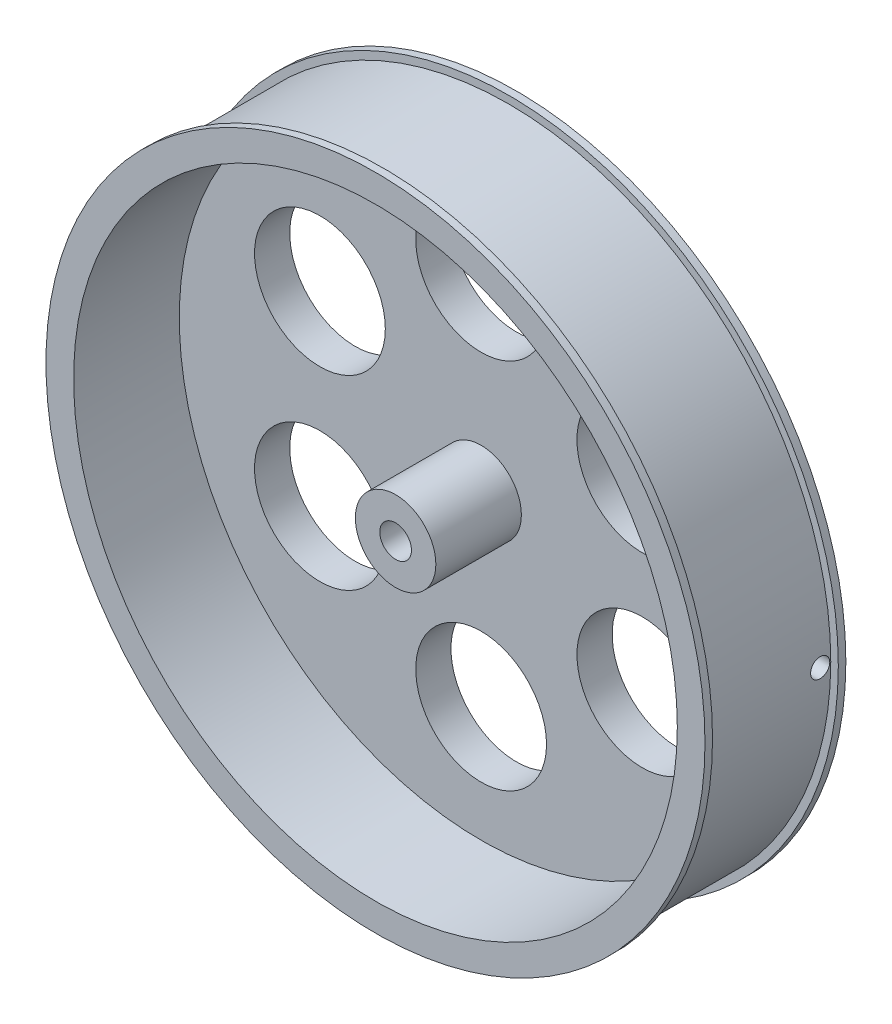
ISO-10303-21;
HEADER;
FILE_DESCRIPTION(('STEP AP214'),'2;1');
FILE_NAME('part.step','',(''),(''),'','','');
FILE_SCHEMA(('AUTOMOTIVE_DESIGN { 1 0 10303 214 1 1 1 1 }'));
ENDSEC;
DATA;
#1=APPLICATION_CONTEXT('core data for automotive mechanical design processes');
#2=APPLICATION_PROTOCOL_DEFINITION('international standard','automotive_design',2000,#1);
#3=PRODUCT_CONTEXT('',#1,'mechanical');
#4=PRODUCT('Part','Part','',(#3));
#5=PRODUCT_RELATED_PRODUCT_CATEGORY('part','',(#4));
#6=PRODUCT_DEFINITION_FORMATION('','',#4);
#7=PRODUCT_DEFINITION_CONTEXT('part definition',#1,'design');
#8=PRODUCT_DEFINITION('design','',#6,#7);
#9=PRODUCT_DEFINITION_SHAPE('','',#8);
#10=(LENGTH_UNIT() NAMED_UNIT(*) SI_UNIT(.MILLI.,.METRE.));
#11=(NAMED_UNIT(*) PLANE_ANGLE_UNIT() SI_UNIT($,.RADIAN.));
#12=(NAMED_UNIT(*) SI_UNIT($,.STERADIAN.) SOLID_ANGLE_UNIT());
#13=UNCERTAINTY_MEASURE_WITH_UNIT(LENGTH_MEASURE(1.E-05),#10,'distance_accuracy_value','');
#14=(GEOMETRIC_REPRESENTATION_CONTEXT(3) GLOBAL_UNCERTAINTY_ASSIGNED_CONTEXT((#13)) GLOBAL_UNIT_ASSIGNED_CONTEXT((#10,
#11,#12)) REPRESENTATION_CONTEXT('',''));
#15=CARTESIAN_POINT('',(0.,0.,0.));
#16=DIRECTION('',(0.,0.,1.));
#17=DIRECTION('',(1.,0.,0.));
#18=AXIS2_PLACEMENT_3D('',#15,#16,#17);
#19=CARTESIAN_POINT('',(0.,0.,28.));
#20=DIRECTION('',(0.,0.,-1.));
#21=DIRECTION('',(-1.,0.,0.));
#22=AXIS2_PLACEMENT_3D('',#19,#20,#21);
#23=CYLINDRICAL_SURFACE('',#22,64.);
#24=CARTESIAN_POINT('',(0.,0.,1.5));
#25=DIRECTION('',(0.,0.,1.));
#26=DIRECTION('',(1.,0.,0.));
#27=AXIS2_PLACEMENT_3D('',#24,#25,#26);
#28=CIRCLE('',#27,64.);
#29=CARTESIAN_POINT('',(64.,0.,1.5));
#30=VERTEX_POINT('',#29);
#31=EDGE_CURVE('E130',#30,#30,#28,.T.);
#32=ORIENTED_EDGE('',*,*,#31,.T.);
#33=EDGE_LOOP('',(#32));
#34=FACE_BOUND('',#33,.T.);
#35=CARTESIAN_POINT('',(0.,0.,26.5));
#36=DIRECTION('',(0.,0.,1.));
#37=DIRECTION('',(1.,0.,0.));
#38=AXIS2_PLACEMENT_3D('',#35,#36,#37);
#39=CIRCLE('',#38,64.);
#40=CARTESIAN_POINT('',(64.,0.,26.5));
#41=VERTEX_POINT('',#40);
#42=EDGE_CURVE('E47',#41,#41,#39,.T.);
#43=ORIENTED_EDGE('',*,*,#42,.F.);
#44=EDGE_LOOP('',(#43));
#45=FACE_BOUND('',#44,.T.);
#46=CARTESIAN_POINT('',(64.,0.,5.5));
#47=CARTESIAN_POINT('',(63.9999996199994,-0.106698612345607,5.49999527608061));
#48=CARTESIAN_POINT('',(63.9997303111057,-0.213473992693703,5.49098199431522));
#49=CARTESIAN_POINT('',(63.9986818741941,-0.424082374028197,5.45515226980288));
#50=CARTESIAN_POINT('',(63.9979021371134,-0.527911705051908,5.42831455769016));
#51=CARTESIAN_POINT('',(63.9959211475545,-0.72954643512145,5.35760220562604));
#52=CARTESIAN_POINT('',(63.9947201012045,-0.827354752525751,5.31373589589952));
#53=CARTESIAN_POINT('',(63.992031970981,-1.01419188196472,5.21022348904253));
#54=CARTESIAN_POINT('',(63.9905449569841,-1.10322283074151,5.15058124545399));
#55=CARTESIAN_POINT('',(63.9874515815209,-1.27004538019352,5.01717851573469));
#56=CARTESIAN_POINT('',(63.9858451749512,-1.34783270032114,4.94341267734249));
#57=CARTESIAN_POINT('',(63.9826944645377,-1.48992390514263,4.78386598718598));
#58=CARTESIAN_POINT('',(63.9811501631684,-1.5542272529904,4.69808465726786));
#59=CARTESIAN_POINT('',(63.9782975894916,-1.66753171355214,4.51692630096137));
#60=CARTESIAN_POINT('',(63.9769893564606,-1.71653028087621,4.42154768189913));
#61=CARTESIAN_POINT('',(63.9747568535961,-1.79781771133189,4.22391355579053));
#62=CARTESIAN_POINT('',(63.9738325822384,-1.83010664079925,4.1216580760465));
#63=CARTESIAN_POINT('',(63.9724725474494,-1.87704909606199,3.91320499276548));
#64=CARTESIAN_POINT('',(63.9720366391171,-1.89170785295673,3.80700856820308));
#65=CARTESIAN_POINT('',(63.9717020450109,-1.90298996714018,3.5936614448837));
#66=CARTESIAN_POINT('',(63.9718033571168,-1.89961339560664,3.48651074989449));
#67=CARTESIAN_POINT('',(63.9725316441729,-1.87492512980514,3.27433219245221));
#68=CARTESIAN_POINT('',(63.973158453323,-1.85361909247487,3.16930367113238));
#69=CARTESIAN_POINT('',(63.9748668133079,-1.793685444515,2.96431477686415));
#70=CARTESIAN_POINT('',(63.9759483651329,-1.75505779616508,2.86435441495292));
#71=CARTESIAN_POINT('',(63.9784444790023,-1.6615709348067,2.67232116840527));
#72=CARTESIAN_POINT('',(63.9798590942345,-1.60670912896074,2.58024954675));
#73=CARTESIAN_POINT('',(63.9828618091305,-1.48231321132906,2.40662122494208));
#74=CARTESIAN_POINT('',(63.9844499091809,-1.41277906683822,2.32506454822823));
#75=CARTESIAN_POINT('',(63.9876213051663,-1.26098029035961,2.17474825428561));
#76=CARTESIAN_POINT('',(63.9892045990093,-1.17871075242353,2.1059935912477));
#77=CARTESIAN_POINT('',(63.9921873051645,-1.00379383541694,1.98327117025075));
#78=CARTESIAN_POINT('',(63.9935867174473,-0.911146454671986,1.92930341467756));
#79=CARTESIAN_POINT('',(63.9960439274215,-0.718101037229735,1.83768732082399));
#80=CARTESIAN_POINT('',(63.9971017218578,-0.617702926688438,1.80003913804868));
#81=CARTESIAN_POINT('',(63.9987564024227,-0.412007241452619,1.74213405226947));
#82=CARTESIAN_POINT('',(63.9993532897805,-0.306709679823791,1.72187710289001));
#83=CARTESIAN_POINT('',(64.000018714961,-0.0942471702280073,1.69933557760619));
#84=CARTESIAN_POINT('',(64.0000874542976,0.0129170498759254,1.69704414699207));
#85=CARTESIAN_POINT('',(63.9996893685882,0.226108663191,1.71048084208262));
#86=CARTESIAN_POINT('',(63.9992225441496,0.332136057691051,1.72620894735491));
#87=CARTESIAN_POINT('',(63.9978060729454,0.540025161753835,1.77523257566562));
#88=CARTESIAN_POINT('',(63.9968565117124,0.641887605820601,1.80852498665189));
#89=CARTESIAN_POINT('',(63.9945815693909,0.838577839143948,1.89172901309807));
#90=CARTESIAN_POINT('',(63.9932561875643,0.933405614584978,1.94164066119583));
#91=CARTESIAN_POINT('',(63.9903784107815,1.11336623529374,2.05668399680052));
#92=CARTESIAN_POINT('',(63.9888259470702,1.19849613033198,2.12182029756429));
#93=CARTESIAN_POINT('',(63.9856691994091,1.35661482842624,2.26545717996146));
#94=CARTESIAN_POINT('',(63.9840649153291,1.42960360099844,2.34395779514886));
#95=CARTESIAN_POINT('',(63.9809848093217,1.56139104567387,2.51212432560449));
#96=CARTESIAN_POINT('',(63.9795090275302,1.62018529440946,2.60179370817698));
#97=CARTESIAN_POINT('',(63.9768529463871,1.72188448540472,2.78973467555335));
#98=CARTESIAN_POINT('',(63.9756726463773,1.76478946306328,2.88800624119227));
#99=CARTESIAN_POINT('',(63.9737408920934,1.83348445072033,3.09034534714766));
#100=CARTESIAN_POINT('',(63.972989366084,1.85927732374467,3.19441191474275));
#101=CARTESIAN_POINT('',(63.9719996911607,1.89302532388065,3.4054007473168));
#102=CARTESIAN_POINT('',(63.9717615418235,1.90098046569827,3.51232300994136));
#103=CARTESIAN_POINT('',(63.9718254969467,1.89882685216755,3.7259438002625));
#104=CARTESIAN_POINT('',(63.972127392715,1.88872507463918,3.83264239843933));
#105=CARTESIAN_POINT('',(63.9732369662478,1.85075872225259,4.04282849862724));
#106=CARTESIAN_POINT('',(63.9740446450153,1.82289411217036,4.14631599427022));
#107=CARTESIAN_POINT('',(63.9760747033709,1.7501940106501,4.34714497018357));
#108=CARTESIAN_POINT('',(63.9772970899118,1.70535823468446,4.44448634738018));
#109=CARTESIAN_POINT('',(63.9800187096145,1.5999909753816,4.63025806174355));
#110=CARTESIAN_POINT('',(63.9815179327465,1.53946006065691,4.71868872157179));
#111=CARTESIAN_POINT('',(63.9846247983773,1.40440041681556,4.88416073072506));
#112=CARTESIAN_POINT('',(63.9862324711014,1.32986777494589,4.96119888565792));
#113=CARTESIAN_POINT('',(63.9893751008632,1.16890523993306,5.10169011322));
#114=CARTESIAN_POINT('',(63.9909100397954,1.08247240521062,5.16513981701297));
#115=CARTESIAN_POINT('',(63.9937347008838,0.900129571652097,5.27666360279237));
#116=CARTESIAN_POINT('',(63.9950242643113,0.804213498837416,5.32472774578347));
#117=CARTESIAN_POINT('',(63.9972099587862,0.605743479037089,5.40401443328386));
#118=CARTESIAN_POINT('',(63.9981065588035,0.503197612887766,5.43525706313565));
#119=CARTESIAN_POINT('',(63.9991656406717,0.333336555604716,5.47173331156169));
#120=CARTESIAN_POINT('',(63.9994771680259,0.26712392271573,5.48231998426404));
#121=CARTESIAN_POINT('',(63.9998944669518,0.133950946908267,5.4964548104222));
#122=CARTESIAN_POINT('',(64.0000002385829,0.0669906042053914,5.5000029659075));
#123=CARTESIAN_POINT('',(64.,0.,5.5));
#124=B_SPLINE_CURVE_WITH_KNOTS('',3,(#46,#47,#48,#49,#50,#51,#52,#53,#54,#55,#56,#57,#58,#59,
#60,#61,#62,#63,#64,#65,#66,#67,#68,#69,#70,#71,#72,#73,#74,#75,#76,#77,#78,#79,#80,#81,#82,#83,
#84,#85,#86,#87,#88,#89,#90,#91,#92,#93,#94,#95,#96,#97,#98,#99,#100,#101,#102,#103,#104,#105,
#106,#107,#108,#109,#110,#111,#112,#113,#114,#115,#116,#117,#118,#119,#120,#121,#122,#123),
.UNSPECIFIED.,.T.,.F.,(4,2,2,2,2,2,2,2,2,2,2,2,2,2,2,2,2,2,2,2,2,2,2,2,2,2,2,2,2,2,2,2,2,2,2,2,
2,2,4),(0.,0.319851312799351,0.640084982098791,0.960162193204059,1.28016129205621,
1.6002818982838,1.92041524726091,2.24060181038508,2.56078710238796,2.88087736783342,
3.20096637002027,3.5209544185612,3.84094316392596,4.16098304388419,4.48102363722917,
4.80118782533059,5.12135206509002,5.44151935554613,5.76168579223955,6.08173006408592,
6.40177397303405,6.72176119548276,7.04174904634525,7.36183398344589,7.6819197242011,
8.00210508327793,8.32228972902593,8.64242079116892,8.96255158938567,9.28255870470103,
9.60256645459825,9.92257956977625,10.2425810929541,10.5626721732605,10.8828425186209,
11.2032192769713,11.523212643638,11.7240309898899,11.9248492782376),.UNSPECIFIED.);
#125=CARTESIAN_POINT('',(64.,0.,5.5));
#126=VERTEX_POINT('',#125);
#127=EDGE_CURVE('E41',#126,#126,#124,.T.);
#128=ORIENTED_EDGE('',*,*,#127,.F.);
#129=EDGE_LOOP('',(#128));
#130=FACE_BOUND('',#129,.T.);
#131=ADVANCED_FACE('F40',(#34,#45,#130),#23,.T.);
#132=CARTESIAN_POINT('',(9.,0.,3.6));
#133=DIRECTION('',(-1.,0.,0.));
#134=DIRECTION('',(0.,0.,1.));
#135=AXIS2_PLACEMENT_3D('',#132,#133,#134);
#136=CYLINDRICAL_SURFACE('',#135,1.3);
#137=CARTESIAN_POINT('',(3.15,0.,4.9));
#138=CARTESIAN_POINT('',(3.14999455244473,-0.069692697613533,4.89999272630519));
#139=CARTESIAN_POINT('',(3.14766021625491,-0.139497834863106,4.89436238526101));
#140=CARTESIAN_POINT('',(3.13854845740953,-0.277132276712566,4.87203965997554));
#141=CARTESIAN_POINT('',(3.1317593212441,-0.344955878583975,4.85531811110427));
#142=CARTESIAN_POINT('',(3.11446798400485,-0.476411584643678,4.81153323455392));
#143=CARTESIAN_POINT('',(3.10397827041878,-0.540056941881002,4.78450466308569));
#144=CARTESIAN_POINT('',(3.08030998752748,-0.661849351900572,4.72101507407814));
#145=CARTESIAN_POINT('',(3.06713226145513,-0.719998120618457,4.68455701362258));
#146=CARTESIAN_POINT('',(3.03868100499926,-0.832113661095373,4.60133811789954));
#147=CARTESIAN_POINT('',(3.02333969010903,-0.88577284856748,4.55418626236761));
#148=CARTESIAN_POINT('',(2.99258803158752,-0.984685291239007,4.45174461965722));
#149=CARTESIAN_POINT('',(2.9771776564409,-1.02993419767832,4.39645064871715));
#150=CARTESIAN_POINT('',(2.94720547499569,-1.1128885038634,4.27607180294733));
#151=CARTESIAN_POINT('',(2.93272003500382,-1.1501269006504,4.21064411294447));
#152=CARTESIAN_POINT('',(2.90730997830691,-1.21293243774455,4.07376843317941));
#153=CARTESIAN_POINT('',(2.89638356244053,-1.23850547776067,4.0023235083177));
#154=CARTESIAN_POINT('',(2.88006089914635,-1.27599047670857,3.85898069301792));
#155=CARTESIAN_POINT('',(2.874426590354,-1.28849371555285,3.78726556616925));
#156=CARTESIAN_POINT('',(2.86864015105848,-1.30132952127152,3.64255090130889));
#157=CARTESIAN_POINT('',(2.86848507854276,-1.30166861954198,3.56955207363371));
#158=CARTESIAN_POINT('',(2.87347276690692,-1.29061252733012,3.43018026574501));
#159=CARTESIAN_POINT('',(2.87821940794458,-1.28009473604467,3.36372068255662));
#160=CARTESIAN_POINT('',(2.89180738957152,-1.24909303221162,3.23361088987512));
#161=CARTESIAN_POINT('',(2.90064949702196,-1.22860725315834,3.16996120897182));
#162=CARTESIAN_POINT('',(2.92163063721902,-1.17785366692838,3.04568727874889));
#163=CARTESIAN_POINT('',(2.93383524673787,-1.14738873728791,2.9851551024315));
#164=CARTESIAN_POINT('',(2.96015031103677,-1.07768075438894,2.86982974518971));
#165=CARTESIAN_POINT('',(2.97426150834656,-1.03843427718825,2.81503881505643));
#166=CARTESIAN_POINT('',(3.00422093418092,-0.94846309656726,2.70797893711454));
#167=CARTESIAN_POINT('',(3.02011626905649,-0.89705726537591,2.65629397759053));
#168=CARTESIAN_POINT('',(3.05086578853972,-0.786147076179482,2.56208467994389));
#169=CARTESIAN_POINT('',(3.06571973784112,-0.726640896738218,2.51956240770441));
#170=CARTESIAN_POINT('',(3.09312944944474,-0.599473145849867,2.4440512144347));
#171=CARTESIAN_POINT('',(3.10562671077283,-0.531659552611123,2.41129551060971));
#172=CARTESIAN_POINT('',(3.12646761198327,-0.390837258748827,2.35786108819404));
#173=CARTESIAN_POINT('',(3.13481350225014,-0.317831397348979,2.33717582537648));
#174=CARTESIAN_POINT('',(3.1459933952581,-0.173580867803542,2.30968178124127));
#175=CARTESIAN_POINT('',(3.14913830223005,-0.102509680841121,2.30208901697536));
#176=CARTESIAN_POINT('',(3.15055112579746,0.0399547989841509,2.29866361336006));
#177=CARTESIAN_POINT('',(3.14882040907143,0.111347995983827,2.30282767847279));
#178=CARTESIAN_POINT('',(3.14087859367634,0.248787202955951,2.32223269072218));
#179=CARTESIAN_POINT('',(3.13488878218215,0.314924644811207,2.33692681774791));
#180=CARTESIAN_POINT('',(3.11926576607795,0.44372605721898,2.37621791649447));
#181=CARTESIAN_POINT('',(3.10963209911692,0.506389585826244,2.40081614492392));
#182=CARTESIAN_POINT('',(3.08727687211328,0.628653575638519,2.46002131175397));
#183=CARTESIAN_POINT('',(3.0744689055268,0.688099029960417,2.49491467625667));
#184=CARTESIAN_POINT('',(3.04713744696318,0.80050288785245,2.57340421869329));
#185=CARTESIAN_POINT('',(3.0326132459771,0.853458591850515,2.61700399858027));
#186=CARTESIAN_POINT('',(3.00215814733459,0.955283335763768,2.71524990436354));
#187=CARTESIAN_POINT('',(2.98620005295157,1.00360493350037,2.77045644717947));
#188=CARTESIAN_POINT('',(2.9555967629026,1.09044630839947,2.88845647008808));
#189=CARTESIAN_POINT('',(2.94095184509543,1.12896401428359,2.95125154929278));
#190=CARTESIAN_POINT('',(2.91455645478511,1.19547633236666,3.08385450404827));
#191=CARTESIAN_POINT('',(2.90284639053251,1.22332656010374,3.15374343461832));
#192=CARTESIAN_POINT('',(2.88421748450953,1.2666316099941,3.29785271253183));
#193=CARTESIAN_POINT('',(2.87729479365167,1.28209639173303,3.37206952803545));
#194=CARTESIAN_POINT('',(2.86960470970629,1.29921080769914,3.51666587845973));
#195=CARTESIAN_POINT('',(2.86841051938737,1.3018187771732,3.58690985476541));
#196=CARTESIAN_POINT('',(2.87118247976143,1.29569391847327,3.72679061386719));
#197=CARTESIAN_POINT('',(2.87514787359779,1.28696275363111,3.79642748421097));
#198=CARTESIAN_POINT('',(2.887405324443,1.25920727299354,3.92990651928881));
#199=CARTESIAN_POINT('',(2.8954955480299,1.24066170927177,3.99386851902532));
#200=CARTESIAN_POINT('',(2.91493664769153,1.19426697515959,4.11779057478751));
#201=CARTESIAN_POINT('',(2.92628843622577,1.16641520089622,4.17774950511656));
#202=CARTESIAN_POINT('',(2.95181105840642,1.10028946762557,4.29585377095957));
#203=CARTESIAN_POINT('',(2.9661093980048,1.06149417996329,4.3536791659792));
#204=CARTESIAN_POINT('',(2.99555031290326,0.975320364877655,4.4622993338792));
#205=CARTESIAN_POINT('',(3.01069317073627,0.92793895290349,4.51309173384283));
#206=CARTESIAN_POINT('',(3.04140631530162,0.821948308848032,4.60990551356312));
#207=CARTESIAN_POINT('',(3.05693082937164,0.762781314202861,4.65533360293075));
#208=CARTESIAN_POINT('',(3.08557476294106,0.637084766387388,4.73564219642614));
#209=CARTESIAN_POINT('',(3.09869308149899,0.570551865201818,4.77051787707461));
#210=CARTESIAN_POINT('',(3.12084832976941,0.433094489401693,4.82795987750108));
#211=CARTESIAN_POINT('',(3.12995119413508,0.362264526731846,4.85072642457413));
#212=CARTESIAN_POINT('',(3.14331936294031,0.217456737130756,4.88381957610576));
#213=CARTESIAN_POINT('',(3.14759986181876,0.143489563712609,4.89418525996516));
#214=CARTESIAN_POINT('',(3.14974769565337,0.0461929267079351,4.89938691694167));
#215=CARTESIAN_POINT('',(3.15000180582642,0.0231026412152468,4.9000024111789));
#216=CARTESIAN_POINT('',(3.15,0.,4.9));
#217=B_SPLINE_CURVE_WITH_KNOTS('',3,(#137,#138,#139,#140,#141,#142,#143,#144,#145,#146,#147,
#148,#149,#150,#151,#152,#153,#154,#155,#156,#157,#158,#159,#160,#161,#162,#163,#164,#165,#166,
#167,#168,#169,#170,#171,#172,#173,#174,#175,#176,#177,#178,#179,#180,#181,#182,#183,#184,#185,
#186,#187,#188,#189,#190,#191,#192,#193,#194,#195,#196,#197,#198,#199,#200,#201,#202,#203,#204,
#205,#206,#207,#208,#209,#210,#211,#212,#213,#214,#215,#216),.UNSPECIFIED.,.T.,.F.,(4,2,2,2,2,2,
2,2,2,2,2,2,2,2,2,2,2,2,2,2,2,2,2,2,2,2,2,2,2,2,2,2,2,2,2,2,2,2,2,4),(0.,0.20901328480785,
0.418578366149569,0.627442936174266,0.836242085609332,1.05447359707122,1.27281763892647,
1.50165433614461,1.73037517142533,1.94823018406225,2.16596822019123,2.36739016109262,
2.56884983277486,2.77455673748443,2.98034398790625,3.20316208508201,3.42603036792918,
3.65385842504045,3.88156284564901,4.09508604360982,4.30854939517011,4.5116635595577,
4.71480350475978,4.9242358796631,5.1337550795437,5.35797507993969,5.58224241228072,
5.80944612804914,6.03646695711871,6.2462795651089,6.45606139927045,6.65644320570938,
6.85688112589053,7.06923977051562,7.28166989078703,7.50915600674821,7.73674594949242,
7.96044543038989,8.18343808424227,8.25272452447899),.UNSPECIFIED.);
#218=CARTESIAN_POINT('',(3.15,0.,4.9));
#219=VERTEX_POINT('',#218);
#220=EDGE_CURVE('E93',#219,#219,#217,.T.);
#221=ORIENTED_EDGE('',*,*,#220,.F.);
#222=EDGE_LOOP('',(#221));
#223=FACE_BOUND('',#222,.T.);
#224=CARTESIAN_POINT('',(8.5,0.,3.6));
#225=DIRECTION('',(1.,0.,0.));
#226=DIRECTION('',(0.,0.,-1.));
#227=AXIS2_PLACEMENT_3D('',#224,#225,#226);
#228=CIRCLE('',#227,1.3);
#229=CARTESIAN_POINT('',(8.5,0.,2.3));
#230=VERTEX_POINT('',#229);
#231=EDGE_CURVE('E98',#230,#230,#228,.T.);
#232=ORIENTED_EDGE('',*,*,#231,.T.);
#233=EDGE_LOOP('',(#232));
#234=FACE_BOUND('',#233,.T.);
#235=ADVANCED_FACE('F105',(#223,#234),#136,.F.);
#236=CARTESIAN_POINT('',(0.,0.,29.));
#237=DIRECTION('',(0.,0.,-1.));
#238=DIRECTION('',(-1.,0.,0.));
#239=AXIS2_PLACEMENT_3D('',#236,#237,#238);
#240=CYLINDRICAL_SURFACE('',#239,3.15);
#241=CARTESIAN_POINT('',(0.,0.,0.));
#242=DIRECTION('',(0.,0.,1.));
#243=DIRECTION('',(1.,0.,0.));
#244=AXIS2_PLACEMENT_3D('',#241,#242,#243);
#245=CIRCLE('',#244,3.15);
#246=CARTESIAN_POINT('',(3.15,0.,0.));
#247=VERTEX_POINT('',#246);
#248=EDGE_CURVE('E69',#247,#247,#245,.F.);
#249=ORIENTED_EDGE('',*,*,#248,.T.);
#250=EDGE_LOOP('',(#249));
#251=FACE_BOUND('',#250,.T.);
#252=CARTESIAN_POINT('',(0.,0.,24.));
#253=DIRECTION('',(0.,0.,1.));
#254=DIRECTION('',(1.,0.,0.));
#255=AXIS2_PLACEMENT_3D('',#252,#253,#254);
#256=CIRCLE('',#255,3.15);
#257=CARTESIAN_POINT('',(3.15,0.,24.));
#258=VERTEX_POINT('',#257);
#259=EDGE_CURVE('E86',#258,#258,#256,.F.);
#260=ORIENTED_EDGE('',*,*,#259,.F.);
#261=EDGE_LOOP('',(#260));
#262=FACE_BOUND('',#261,.T.);
#263=ORIENTED_EDGE('',*,*,#220,.T.);
#264=EDGE_LOOP('',(#263));
#265=FACE_BOUND('',#264,.T.);
#266=ADVANCED_FACE('F97',(#251,#262,#265),#240,.F.);
#267=CARTESIAN_POINT('',(0.,0.,28.));
#268=DIRECTION('',(0.,0.,1.));
#269=DIRECTION('',(1.,0.,0.));
#270=AXIS2_PLACEMENT_3D('',#267,#268,#269);
#271=PLANE('',#270);
#272=CARTESIAN_POINT('',(0.,0.,28.));
#273=DIRECTION('',(0.,0.,1.));
#274=DIRECTION('',(1.,0.,0.));
#275=AXIS2_PLACEMENT_3D('',#272,#273,#274);
#276=CIRCLE('',#275,65.5);
#277=CARTESIAN_POINT('',(65.5,0.,28.));
#278=VERTEX_POINT('',#277);
#279=EDGE_CURVE('E156',#278,#278,#276,.T.);
#280=ORIENTED_EDGE('',*,*,#279,.T.);
#281=EDGE_LOOP('',(#280));
#282=FACE_BOUND('',#281,.T.);
#283=CARTESIAN_POINT('',(0.,0.,28.));
#284=DIRECTION('',(0.,0.,1.));
#285=DIRECTION('',(1.,0.,0.));
#286=AXIS2_PLACEMENT_3D('',#283,#284,#285);
#287=CIRCLE('',#286,60.);
#288=CARTESIAN_POINT('',(60.,0.,28.));
#289=VERTEX_POINT('',#288);
#290=EDGE_CURVE('E53',#289,#289,#287,.T.);
#291=ORIENTED_EDGE('',*,*,#290,.F.);
#292=EDGE_LOOP('',(#291));
#293=FACE_BOUND('',#292,.T.);
#294=ADVANCED_FACE('F172',(#282,#293),#271,.T.);
#295=CARTESIAN_POINT('',(0.,0.,0.));
#296=DIRECTION('',(0.,0.,1.));
#297=DIRECTION('',(1.,0.,0.));
#298=AXIS2_PLACEMENT_3D('',#295,#296,#297);
#299=PLANE('',#298);
#300=ORIENTED_EDGE('',*,*,#248,.F.);
#301=EDGE_LOOP('',(#300));
#302=FACE_BOUND('',#301,.T.);
#303=CARTESIAN_POINT('',(32.0429399400242,-18.5,0.));
#304=DIRECTION('',(0.,0.,1.));
#305=DIRECTION('',(1.,0.,0.));
#306=AXIS2_PLACEMENT_3D('',#303,#304,#305);
#307=CIRCLE('',#306,13.);
#308=CARTESIAN_POINT('',(45.0429399400242,-18.5,0.));
#309=VERTEX_POINT('',#308);
#310=EDGE_CURVE('E87',#309,#309,#307,.F.);
#311=ORIENTED_EDGE('',*,*,#310,.F.);
#312=EDGE_LOOP('',(#311));
#313=FACE_BOUND('',#312,.T.);
#314=CARTESIAN_POINT('',(0.,-37.,0.));
#315=DIRECTION('',(0.,0.,1.));
#316=DIRECTION('',(1.,0.,0.));
#317=AXIS2_PLACEMENT_3D('',#314,#315,#316);
#318=CIRCLE('',#317,13.);
#319=CARTESIAN_POINT('',(13.,-37.,0.));
#320=VERTEX_POINT('',#319);
#321=EDGE_CURVE('E85',#320,#320,#318,.F.);
#322=ORIENTED_EDGE('',*,*,#321,.F.);
#323=EDGE_LOOP('',(#322));
#324=FACE_BOUND('',#323,.T.);
#325=CARTESIAN_POINT('',(-32.0429399400242,-18.5,0.));
#326=DIRECTION('',(0.,0.,1.));
#327=DIRECTION('',(1.,0.,0.));
#328=AXIS2_PLACEMENT_3D('',#325,#326,#327);
#329=CIRCLE('',#328,13.);
#330=CARTESIAN_POINT('',(-19.0429399400242,-18.5,0.));
#331=VERTEX_POINT('',#330);
#332=EDGE_CURVE('E78',#331,#331,#329,.F.);
#333=ORIENTED_EDGE('',*,*,#332,.F.);
#334=EDGE_LOOP('',(#333));
#335=FACE_BOUND('',#334,.T.);
#336=CARTESIAN_POINT('',(-32.0429399400242,18.5,0.));
#337=DIRECTION('',(0.,0.,1.));
#338=DIRECTION('',(1.,0.,0.));
#339=AXIS2_PLACEMENT_3D('',#336,#337,#338);
#340=CIRCLE('',#339,13.);
#341=CARTESIAN_POINT('',(-19.0429399400242,18.5,0.));
#342=VERTEX_POINT('',#341);
#343=EDGE_CURVE('E73',#342,#342,#340,.F.);
#344=ORIENTED_EDGE('',*,*,#343,.F.);
#345=EDGE_LOOP('',(#344));
#346=FACE_BOUND('',#345,.T.);
#347=CARTESIAN_POINT('',(0.,37.,0.));
#348=DIRECTION('',(0.,0.,1.));
#349=DIRECTION('',(1.,0.,0.));
#350=AXIS2_PLACEMENT_3D('',#347,#348,#349);
#351=CIRCLE('',#350,13.);
#352=CARTESIAN_POINT('',(13.,37.,0.));
#353=VERTEX_POINT('',#352);
#354=EDGE_CURVE('E72',#353,#353,#351,.F.);
#355=ORIENTED_EDGE('',*,*,#354,.F.);
#356=EDGE_LOOP('',(#355));
#357=FACE_BOUND('',#356,.T.);
#358=CARTESIAN_POINT('',(32.0429399400242,18.5,0.));
#359=DIRECTION('',(0.,0.,1.));
#360=DIRECTION('',(1.,0.,0.));
#361=AXIS2_PLACEMENT_3D('',#358,#359,#360);
#362=CIRCLE('',#361,13.);
#363=CARTESIAN_POINT('',(45.0429399400242,18.5,0.));
#364=VERTEX_POINT('',#363);
#365=EDGE_CURVE('E67',#364,#364,#362,.F.);
#366=ORIENTED_EDGE('',*,*,#365,.F.);
#367=EDGE_LOOP('',(#366));
#368=FACE_BOUND('',#367,.T.);
#369=CARTESIAN_POINT('',(0.,0.,0.));
#370=DIRECTION('',(0.,0.,1.));
#371=DIRECTION('',(1.,0.,0.));
#372=AXIS2_PLACEMENT_3D('',#369,#370,#371);
#373=CIRCLE('',#372,65.5);
#374=CARTESIAN_POINT('',(65.5,0.,0.));
#375=VERTEX_POINT('',#374);
#376=EDGE_CURVE('E157',#375,#375,#373,.T.);
#377=ORIENTED_EDGE('',*,*,#376,.F.);
#378=EDGE_LOOP('',(#377));
#379=FACE_BOUND('',#378,.T.);
#380=ADVANCED_FACE('F173',(#302,#313,#324,#335,#346,#357,#368,#379),#299,.F.);
#381=CARTESIAN_POINT('',(0.,0.,28.));
#382=DIRECTION('',(0.,0.,-1.));
#383=DIRECTION('',(-1.,0.,0.));
#384=AXIS2_PLACEMENT_3D('',#381,#382,#383);
#385=CYLINDRICAL_SURFACE('',#384,60.);
#386=CARTESIAN_POINT('',(0.,0.,7.));
#387=DIRECTION('',(0.,0.,1.));
#388=DIRECTION('',(1.,0.,0.));
#389=AXIS2_PLACEMENT_3D('',#386,#387,#388);
#390=CIRCLE('',#389,60.);
#391=CARTESIAN_POINT('',(60.,0.,7.));
#392=VERTEX_POINT('',#391);
#393=EDGE_CURVE('E10',#392,#392,#390,.T.);
#394=ORIENTED_EDGE('',*,*,#393,.F.);
#395=EDGE_LOOP('',(#394));
#396=FACE_BOUND('',#395,.T.);
#397=ORIENTED_EDGE('',*,*,#290,.T.);
#398=EDGE_LOOP('',(#397));
#399=FACE_BOUND('',#398,.T.);
#400=ADVANCED_FACE('F168',(#396,#399),#385,.F.);
#401=CARTESIAN_POINT('',(0.,0.,1.5));
#402=DIRECTION('',(0.,0.,1.));
#403=DIRECTION('',(1.,0.,0.));
#404=AXIS2_PLACEMENT_3D('',#401,#402,#403);
#405=PLANE('',#404);
#406=ORIENTED_EDGE('',*,*,#31,.F.);
#407=EDGE_LOOP('',(#406));
#408=FACE_BOUND('',#407,.T.);
#409=CARTESIAN_POINT('',(0.,0.,1.5));
#410=DIRECTION('',(0.,0.,1.));
#411=DIRECTION('',(1.,0.,0.));
#412=AXIS2_PLACEMENT_3D('',#409,#410,#411);
#413=CIRCLE('',#412,65.5);
#414=CARTESIAN_POINT('',(65.5,0.,1.5));
#415=VERTEX_POINT('',#414);
#416=EDGE_CURVE('E165',#415,#415,#413,.T.);
#417=ORIENTED_EDGE('',*,*,#416,.T.);
#418=EDGE_LOOP('',(#417));
#419=FACE_BOUND('',#418,.T.);
#420=ADVANCED_FACE('F187',(#408,#419),#405,.T.);
#421=CARTESIAN_POINT('',(0.,0.,1.5));
#422=DIRECTION('',(0.,0.,-1.));
#423=DIRECTION('',(-1.,0.,0.));
#424=AXIS2_PLACEMENT_3D('',#421,#422,#423);
#425=CYLINDRICAL_SURFACE('',#424,65.5);
#426=ORIENTED_EDGE('',*,*,#416,.F.);
#427=EDGE_LOOP('',(#426));
#428=FACE_BOUND('',#427,.T.);
#429=ORIENTED_EDGE('',*,*,#376,.T.);
#430=EDGE_LOOP('',(#429));
#431=FACE_BOUND('',#430,.T.);
#432=ADVANCED_FACE('F188',(#428,#431),#425,.T.);
#433=CARTESIAN_POINT('',(0.,0.,26.5));
#434=DIRECTION('',(0.,0.,1.));
#435=DIRECTION('',(1.,0.,0.));
#436=AXIS2_PLACEMENT_3D('',#433,#434,#435);
#437=PLANE('',#436);
#438=ORIENTED_EDGE('',*,*,#42,.T.);
#439=EDGE_LOOP('',(#438));
#440=FACE_BOUND('',#439,.T.);
#441=CARTESIAN_POINT('',(0.,0.,26.5));
#442=DIRECTION('',(0.,0.,1.));
#443=DIRECTION('',(1.,0.,0.));
#444=AXIS2_PLACEMENT_3D('',#441,#442,#443);
#445=CIRCLE('',#444,65.5);
#446=CARTESIAN_POINT('',(65.5,0.,26.5));
#447=VERTEX_POINT('',#446);
#448=EDGE_CURVE('E61',#447,#447,#445,.T.);
#449=ORIENTED_EDGE('',*,*,#448,.F.);
#450=EDGE_LOOP('',(#449));
#451=FACE_BOUND('',#450,.T.);
#452=ADVANCED_FACE('F192',(#440,#451),#437,.F.);
#453=CARTESIAN_POINT('',(0.,0.,28.));
#454=DIRECTION('',(0.,0.,-1.));
#455=DIRECTION('',(-1.,0.,0.));
#456=AXIS2_PLACEMENT_3D('',#453,#454,#455);
#457=CYLINDRICAL_SURFACE('',#456,65.5);
#458=ORIENTED_EDGE('',*,*,#279,.F.);
#459=EDGE_LOOP('',(#458));
#460=FACE_BOUND('',#459,.T.);
#461=ORIENTED_EDGE('',*,*,#448,.T.);
#462=EDGE_LOOP('',(#461));
#463=FACE_BOUND('',#462,.T.);
#464=ADVANCED_FACE('F198',(#460,#463),#457,.T.);
#465=CARTESIAN_POINT('',(0.,0.,7.));
#466=DIRECTION('',(0.,0.,1.));
#467=DIRECTION('',(1.,0.,0.));
#468=AXIS2_PLACEMENT_3D('',#465,#466,#467);
#469=PLANE('',#468);
#470=CARTESIAN_POINT('',(32.0429399400242,-18.5,7.));
#471=DIRECTION('',(0.,0.,1.));
#472=DIRECTION('',(1.,0.,0.));
#473=AXIS2_PLACEMENT_3D('',#470,#471,#472);
#474=CIRCLE('',#473,13.);
#475=CARTESIAN_POINT('',(45.0429399400242,-18.5,7.));
#476=VERTEX_POINT('',#475);
#477=EDGE_CURVE('E81',#476,#476,#474,.F.);
#478=ORIENTED_EDGE('',*,*,#477,.T.);
#479=EDGE_LOOP('',(#478));
#480=FACE_BOUND('',#479,.T.);
#481=CARTESIAN_POINT('',(0.,-37.,7.));
#482=DIRECTION('',(0.,0.,1.));
#483=DIRECTION('',(1.,0.,0.));
#484=AXIS2_PLACEMENT_3D('',#481,#482,#483);
#485=CIRCLE('',#484,13.);
#486=CARTESIAN_POINT('',(13.,-37.,7.));
#487=VERTEX_POINT('',#486);
#488=EDGE_CURVE('E80',#487,#487,#485,.F.);
#489=ORIENTED_EDGE('',*,*,#488,.T.);
#490=EDGE_LOOP('',(#489));
#491=FACE_BOUND('',#490,.T.);
#492=CARTESIAN_POINT('',(-32.0429399400242,-18.5,7.));
#493=DIRECTION('',(0.,0.,1.));
#494=DIRECTION('',(1.,0.,0.));
#495=AXIS2_PLACEMENT_3D('',#492,#493,#494);
#496=CIRCLE('',#495,13.);
#497=CARTESIAN_POINT('',(-19.0429399400242,-18.5,7.));
#498=VERTEX_POINT('',#497);
#499=EDGE_CURVE('E76',#498,#498,#496,.F.);
#500=ORIENTED_EDGE('',*,*,#499,.T.);
#501=EDGE_LOOP('',(#500));
#502=FACE_BOUND('',#501,.T.);
#503=CARTESIAN_POINT('',(-32.0429399400242,18.5,7.));
#504=DIRECTION('',(0.,0.,1.));
#505=DIRECTION('',(1.,0.,0.));
#506=AXIS2_PLACEMENT_3D('',#503,#504,#505);
#507=CIRCLE('',#506,13.);
#508=CARTESIAN_POINT('',(-19.0429399400242,18.5,7.));
#509=VERTEX_POINT('',#508);
#510=EDGE_CURVE('E75',#509,#509,#507,.F.);
#511=ORIENTED_EDGE('',*,*,#510,.T.);
#512=EDGE_LOOP('',(#511));
#513=FACE_BOUND('',#512,.T.);
#514=CARTESIAN_POINT('',(0.,37.,7.));
#515=DIRECTION('',(0.,0.,1.));
#516=DIRECTION('',(1.,0.,0.));
#517=AXIS2_PLACEMENT_3D('',#514,#515,#516);
#518=CIRCLE('',#517,13.);
#519=CARTESIAN_POINT('',(13.,37.,7.));
#520=VERTEX_POINT('',#519);
#521=EDGE_CURVE('E70',#520,#520,#518,.F.);
#522=ORIENTED_EDGE('',*,*,#521,.T.);
#523=EDGE_LOOP('',(#522));
#524=FACE_BOUND('',#523,.T.);
#525=CARTESIAN_POINT('',(32.0429399400242,18.5,7.));
#526=DIRECTION('',(0.,0.,1.));
#527=DIRECTION('',(1.,0.,0.));
#528=AXIS2_PLACEMENT_3D('',#525,#526,#527);
#529=CIRCLE('',#528,13.);
#530=CARTESIAN_POINT('',(45.0429399400242,18.5,7.));
#531=VERTEX_POINT('',#530);
#532=EDGE_CURVE('E64',#531,#531,#529,.F.);
#533=ORIENTED_EDGE('',*,*,#532,.T.);
#534=EDGE_LOOP('',(#533));
#535=FACE_BOUND('',#534,.T.);
#536=CARTESIAN_POINT('',(0.,0.,7.));
#537=DIRECTION('',(0.,0.,1.));
#538=DIRECTION('',(1.,0.,0.));
#539=AXIS2_PLACEMENT_3D('',#536,#537,#538);
#540=CIRCLE('',#539,8.);
#541=CARTESIAN_POINT('',(8.,0.,7.));
#542=VERTEX_POINT('',#541);
#543=EDGE_CURVE('E59',#542,#542,#540,.F.);
#544=ORIENTED_EDGE('',*,*,#543,.T.);
#545=EDGE_LOOP('',(#544));
#546=FACE_BOUND('',#545,.T.);
#547=ORIENTED_EDGE('',*,*,#393,.T.);
#548=EDGE_LOOP('',(#547));
#549=FACE_BOUND('',#548,.T.);
#550=ADVANCED_FACE('F200',(#480,#491,#502,#513,#524,#535,#546,#549),#469,.T.);
#551=CARTESIAN_POINT('',(0.,0.,24.));
#552=DIRECTION('',(0.,0.,-1.));
#553=DIRECTION('',(-1.,0.,0.));
#554=AXIS2_PLACEMENT_3D('',#551,#552,#553);
#555=CYLINDRICAL_SURFACE('',#554,8.);
#556=ORIENTED_EDGE('',*,*,#543,.F.);
#557=EDGE_LOOP('',(#556));
#558=FACE_BOUND('',#557,.T.);
#559=CARTESIAN_POINT('',(0.,0.,24.));
#560=DIRECTION('',(0.,0.,1.));
#561=DIRECTION('',(1.,0.,0.));
#562=AXIS2_PLACEMENT_3D('',#559,#560,#561);
#563=CIRCLE('',#562,8.);
#564=CARTESIAN_POINT('',(8.,0.,24.));
#565=VERTEX_POINT('',#564);
#566=EDGE_CURVE('E62',#565,#565,#563,.T.);
#567=ORIENTED_EDGE('',*,*,#566,.F.);
#568=EDGE_LOOP('',(#567));
#569=FACE_BOUND('',#568,.T.);
#570=ADVANCED_FACE('F202',(#558,#569),#555,.T.);
#571=CARTESIAN_POINT('',(0.,0.,24.));
#572=DIRECTION('',(0.,0.,1.));
#573=DIRECTION('',(1.,0.,0.));
#574=AXIS2_PLACEMENT_3D('',#571,#572,#573);
#575=PLANE('',#574);
#576=ORIENTED_EDGE('',*,*,#259,.T.);
#577=EDGE_LOOP('',(#576));
#578=FACE_BOUND('',#577,.T.);
#579=ORIENTED_EDGE('',*,*,#566,.T.);
#580=EDGE_LOOP('',(#579));
#581=FACE_BOUND('',#580,.T.);
#582=ADVANCED_FACE('F207',(#578,#581),#575,.T.);
#583=CARTESIAN_POINT('',(32.0429399400242,18.5,8.));
#584=DIRECTION('',(0.,0.,-1.));
#585=DIRECTION('',(-1.,0.,0.));
#586=AXIS2_PLACEMENT_3D('',#583,#584,#585);
#587=CYLINDRICAL_SURFACE('',#586,13.);
#588=ORIENTED_EDGE('',*,*,#532,.F.);
#589=EDGE_LOOP('',(#588));
#590=FACE_BOUND('',#589,.T.);
#591=ORIENTED_EDGE('',*,*,#365,.T.);
#592=EDGE_LOOP('',(#591));
#593=FACE_BOUND('',#592,.T.);
#594=ADVANCED_FACE('F213',(#590,#593),#587,.F.);
#595=CARTESIAN_POINT('',(0.,37.,8.));
#596=DIRECTION('',(0.,0.,-1.));
#597=DIRECTION('',(-1.,0.,0.));
#598=AXIS2_PLACEMENT_3D('',#595,#596,#597);
#599=CYLINDRICAL_SURFACE('',#598,13.);
#600=ORIENTED_EDGE('',*,*,#521,.F.);
#601=EDGE_LOOP('',(#600));
#602=FACE_BOUND('',#601,.T.);
#603=ORIENTED_EDGE('',*,*,#354,.T.);
#604=EDGE_LOOP('',(#603));
#605=FACE_BOUND('',#604,.T.);
#606=ADVANCED_FACE('F220',(#602,#605),#599,.F.);
#607=CARTESIAN_POINT('',(-32.0429399400242,18.5,8.));
#608=DIRECTION('',(0.,0.,-1.));
#609=DIRECTION('',(-1.,0.,0.));
#610=AXIS2_PLACEMENT_3D('',#607,#608,#609);
#611=CYLINDRICAL_SURFACE('',#610,13.);
#612=ORIENTED_EDGE('',*,*,#510,.F.);
#613=EDGE_LOOP('',(#612));
#614=FACE_BOUND('',#613,.T.);
#615=ORIENTED_EDGE('',*,*,#343,.T.);
#616=EDGE_LOOP('',(#615));
#617=FACE_BOUND('',#616,.T.);
#618=ADVANCED_FACE('F228',(#614,#617),#611,.F.);
#619=CARTESIAN_POINT('',(-32.0429399400242,-18.5,8.));
#620=DIRECTION('',(0.,0.,-1.));
#621=DIRECTION('',(-1.,0.,0.));
#622=AXIS2_PLACEMENT_3D('',#619,#620,#621);
#623=CYLINDRICAL_SURFACE('',#622,13.);
#624=ORIENTED_EDGE('',*,*,#499,.F.);
#625=EDGE_LOOP('',(#624));
#626=FACE_BOUND('',#625,.T.);
#627=ORIENTED_EDGE('',*,*,#332,.T.);
#628=EDGE_LOOP('',(#627));
#629=FACE_BOUND('',#628,.T.);
#630=ADVANCED_FACE('F223',(#626,#629),#623,.F.);
#631=CARTESIAN_POINT('',(0.,-37.,8.));
#632=DIRECTION('',(0.,0.,-1.));
#633=DIRECTION('',(-1.,0.,0.));
#634=AXIS2_PLACEMENT_3D('',#631,#632,#633);
#635=CYLINDRICAL_SURFACE('',#634,13.);
#636=ORIENTED_EDGE('',*,*,#488,.F.);
#637=EDGE_LOOP('',(#636));
#638=FACE_BOUND('',#637,.T.);
#639=ORIENTED_EDGE('',*,*,#321,.T.);
#640=EDGE_LOOP('',(#639));
#641=FACE_BOUND('',#640,.T.);
#642=ADVANCED_FACE('F222',(#638,#641),#635,.F.);
#643=CARTESIAN_POINT('',(32.0429399400242,-18.5,8.));
#644=DIRECTION('',(0.,0.,-1.));
#645=DIRECTION('',(-1.,0.,0.));
#646=AXIS2_PLACEMENT_3D('',#643,#644,#645);
#647=CYLINDRICAL_SURFACE('',#646,13.);
#648=ORIENTED_EDGE('',*,*,#477,.F.);
#649=EDGE_LOOP('',(#648));
#650=FACE_BOUND('',#649,.T.);
#651=ORIENTED_EDGE('',*,*,#310,.T.);
#652=EDGE_LOOP('',(#651));
#653=FACE_BOUND('',#652,.T.);
#654=ADVANCED_FACE('F112',(#650,#653),#647,.F.);
#655=CARTESIAN_POINT('',(66.,0.,3.6));
#656=DIRECTION('',(-1.,0.,0.));
#657=DIRECTION('',(0.,0.,1.));
#658=AXIS2_PLACEMENT_3D('',#655,#656,#657);
#659=CYLINDRICAL_SURFACE('',#658,1.9);
#660=CARTESIAN_POINT('',(8.5,0.,3.6));
#661=DIRECTION('',(1.,0.,0.));
#662=DIRECTION('',(0.,0.,-1.));
#663=AXIS2_PLACEMENT_3D('',#660,#661,#662);
#664=CIRCLE('',#663,1.9);
#665=CARTESIAN_POINT('',(8.5,0.,1.7));
#666=VERTEX_POINT('',#665);
#667=EDGE_CURVE('E133',#666,#666,#664,.T.);
#668=ORIENTED_EDGE('',*,*,#667,.F.);
#669=EDGE_LOOP('',(#668));
#670=FACE_BOUND('',#669,.T.);
#671=ORIENTED_EDGE('',*,*,#127,.T.);
#672=EDGE_LOOP('',(#671));
#673=FACE_BOUND('',#672,.T.);
#674=ADVANCED_FACE('F106',(#670,#673),#659,.F.);
#675=CARTESIAN_POINT('',(8.5,0.,3.6));
#676=DIRECTION('',(1.,0.,0.));
#677=DIRECTION('',(0.,0.,-1.));
#678=AXIS2_PLACEMENT_3D('',#675,#676,#677);
#679=PLANE('',#678);
#680=ORIENTED_EDGE('',*,*,#231,.F.);
#681=EDGE_LOOP('',(#680));
#682=FACE_BOUND('',#681,.T.);
#683=ORIENTED_EDGE('',*,*,#667,.T.);
#684=EDGE_LOOP('',(#683));
#685=FACE_BOUND('',#684,.T.);
#686=ADVANCED_FACE('F109',(#682,#685),#679,.T.);
#687=CLOSED_SHELL('',(#131,#235,#266,#294,#380,#400,#420,#432,#452,#464,#550,#570,#582,#594,
#606,#618,#630,#642,#654,#674,#686));
#688=MANIFOLD_SOLID_BREP('B2',#687);
#689=ADVANCED_BREP_SHAPE_REPRESENTATION('',(#18,#688),#14);
#690=SHAPE_DEFINITION_REPRESENTATION(#9,#689);
ENDSEC;
END-ISO-10303-21;
